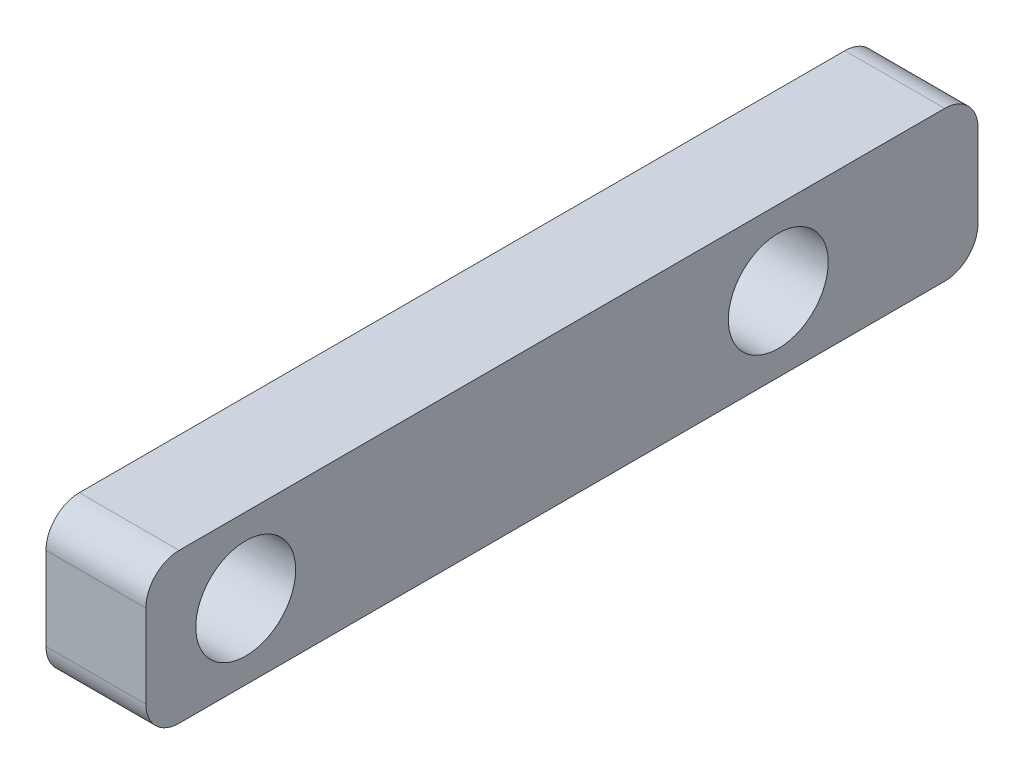
ISO-10303-21;
HEADER;
FILE_DESCRIPTION(('STEP AP214'),'2;1');
FILE_NAME('part.step','',(''),(''),'','','');
FILE_SCHEMA(('AUTOMOTIVE_DESIGN { 1 0 10303 214 1 1 1 1 }'));
ENDSEC;
DATA;
#1=APPLICATION_CONTEXT('core data for automotive mechanical design processes');
#2=APPLICATION_PROTOCOL_DEFINITION('international standard','automotive_design',2000,#1);
#3=PRODUCT_CONTEXT('',#1,'mechanical');
#4=PRODUCT('Part','Part','',(#3));
#5=PRODUCT_RELATED_PRODUCT_CATEGORY('part','',(#4));
#6=PRODUCT_DEFINITION_FORMATION('','',#4);
#7=PRODUCT_DEFINITION_CONTEXT('part definition',#1,'design');
#8=PRODUCT_DEFINITION('design','',#6,#7);
#9=PRODUCT_DEFINITION_SHAPE('','',#8);
#10=(LENGTH_UNIT() NAMED_UNIT(*) SI_UNIT(.MILLI.,.METRE.));
#11=(NAMED_UNIT(*) PLANE_ANGLE_UNIT() SI_UNIT($,.RADIAN.));
#12=(NAMED_UNIT(*) SI_UNIT($,.STERADIAN.) SOLID_ANGLE_UNIT());
#13=UNCERTAINTY_MEASURE_WITH_UNIT(LENGTH_MEASURE(1.E-05),#10,'distance_accuracy_value','');
#14=(GEOMETRIC_REPRESENTATION_CONTEXT(3) GLOBAL_UNCERTAINTY_ASSIGNED_CONTEXT((#13)) GLOBAL_UNIT_ASSIGNED_CONTEXT((#10,
#11,#12)) REPRESENTATION_CONTEXT('',''));
#15=CARTESIAN_POINT('',(0.,0.,0.));
#16=DIRECTION('',(0.,0.,1.));
#17=DIRECTION('',(1.,0.,0.));
#18=AXIS2_PLACEMENT_3D('',#15,#16,#17);
#19=CARTESIAN_POINT('',(1.5,-1.25,11.5));
#20=DIRECTION('',(-1.,0.,0.));
#21=DIRECTION('',(0.,0.,1.));
#22=AXIS2_PLACEMENT_3D('',#19,#20,#21);
#23=CYLINDRICAL_SURFACE('',#22,1.);
#24=CARTESIAN_POINT('',(-1.5,-1.25,11.5));
#25=DIRECTION('',(1.,0.,0.));
#26=DIRECTION('',(0.,0.,-1.));
#27=AXIS2_PLACEMENT_3D('',#24,#25,#26);
#28=CIRCLE('',#27,1.);
#29=CARTESIAN_POINT('',(-1.5,-1.25,12.5));
#30=VERTEX_POINT('',#29);
#31=CARTESIAN_POINT('',(-1.5,-2.25,11.5));
#32=VERTEX_POINT('',#31);
#33=EDGE_CURVE('E128',#30,#32,#28,.T.);
#34=ORIENTED_EDGE('',*,*,#33,.T.);
#35=DIRECTION('',(-1.,0.,0.));
#36=VECTOR('',#35,1.);
#37=CARTESIAN_POINT('',(1.5,-2.25,11.5));
#38=LINE('',#37,#36);
#39=CARTESIAN_POINT('',(1.5,-2.25,11.5));
#40=VERTEX_POINT('',#39);
#41=EDGE_CURVE('E11',#40,#32,#38,.T.);
#42=ORIENTED_EDGE('',*,*,#41,.F.);
#43=CARTESIAN_POINT('',(1.5,-1.25,11.5));
#44=DIRECTION('',(1.,0.,0.));
#45=DIRECTION('',(0.,0.,-1.));
#46=AXIS2_PLACEMENT_3D('',#43,#44,#45);
#47=CIRCLE('',#46,1.);
#48=CARTESIAN_POINT('',(1.5,-1.25,12.5));
#49=VERTEX_POINT('',#48);
#50=EDGE_CURVE('E143',#49,#40,#47,.T.);
#51=ORIENTED_EDGE('',*,*,#50,.F.);
#52=DIRECTION('',(-1.,0.,0.));
#53=VECTOR('',#52,1.);
#54=CARTESIAN_POINT('',(1.5,-1.25,12.5));
#55=LINE('',#54,#53);
#56=EDGE_CURVE('E124',#49,#30,#55,.T.);
#57=ORIENTED_EDGE('',*,*,#56,.T.);
#58=EDGE_LOOP('',(#34,#42,#51,#57));
#59=FACE_BOUND('',#58,.T.);
#60=ADVANCED_FACE('F32',(#59),#23,.T.);
#61=CARTESIAN_POINT('',(1.5,-2.25,11.5));
#62=DIRECTION('',(0.,1.,0.));
#63=DIRECTION('',(0.,0.,1.));
#64=AXIS2_PLACEMENT_3D('',#61,#62,#63);
#65=PLANE('',#64);
#66=DIRECTION('',(0.,0.,-1.));
#67=VECTOR('',#66,1.);
#68=CARTESIAN_POINT('',(-1.5,-2.25,11.5));
#69=LINE('',#68,#67);
#70=CARTESIAN_POINT('',(-1.5,-2.25,-11.5));
#71=VERTEX_POINT('',#70);
#72=EDGE_CURVE('E131',#32,#71,#69,.T.);
#73=ORIENTED_EDGE('',*,*,#72,.T.);
#74=DIRECTION('',(-1.,0.,0.));
#75=VECTOR('',#74,1.);
#76=CARTESIAN_POINT('',(1.5,-2.25,-11.5));
#77=LINE('',#76,#75);
#78=CARTESIAN_POINT('',(1.5,-2.25,-11.5));
#79=VERTEX_POINT('',#78);
#80=EDGE_CURVE('E40',#79,#71,#77,.T.);
#81=ORIENTED_EDGE('',*,*,#80,.F.);
#82=DIRECTION('',(0.,0.,-1.));
#83=VECTOR('',#82,1.);
#84=CARTESIAN_POINT('',(1.5,-2.25,11.5));
#85=LINE('',#84,#83);
#86=EDGE_CURVE('E91',#40,#79,#85,.T.);
#87=ORIENTED_EDGE('',*,*,#86,.F.);
#88=ORIENTED_EDGE('',*,*,#41,.T.);
#89=EDGE_LOOP('',(#73,#81,#87,#88));
#90=FACE_BOUND('',#89,.T.);
#91=ADVANCED_FACE('F210',(#90),#65,.F.);
#92=CARTESIAN_POINT('',(1.5,-1.25,-11.5));
#93=DIRECTION('',(-1.,0.,0.));
#94=DIRECTION('',(0.,0.,1.));
#95=AXIS2_PLACEMENT_3D('',#92,#93,#94);
#96=CYLINDRICAL_SURFACE('',#95,1.);
#97=CARTESIAN_POINT('',(-1.5,-1.25,-11.5));
#98=DIRECTION('',(1.,0.,0.));
#99=DIRECTION('',(0.,0.,-1.));
#100=AXIS2_PLACEMENT_3D('',#97,#98,#99);
#101=CIRCLE('',#100,1.);
#102=CARTESIAN_POINT('',(-1.5,-1.25,-12.5));
#103=VERTEX_POINT('',#102);
#104=EDGE_CURVE('E134',#71,#103,#101,.T.);
#105=ORIENTED_EDGE('',*,*,#104,.T.);
#106=DIRECTION('',(-1.,0.,0.));
#107=VECTOR('',#106,1.);
#108=CARTESIAN_POINT('',(1.5,-1.25,-12.5));
#109=LINE('',#108,#107);
#110=CARTESIAN_POINT('',(1.5,-1.25,-12.5));
#111=VERTEX_POINT('',#110);
#112=EDGE_CURVE('E150',#111,#103,#109,.T.);
#113=ORIENTED_EDGE('',*,*,#112,.F.);
#114=CARTESIAN_POINT('',(1.5,-1.25,-11.5));
#115=DIRECTION('',(1.,0.,0.));
#116=DIRECTION('',(0.,0.,-1.));
#117=AXIS2_PLACEMENT_3D('',#114,#115,#116);
#118=CIRCLE('',#117,1.);
#119=EDGE_CURVE('E158',#79,#111,#118,.T.);
#120=ORIENTED_EDGE('',*,*,#119,.F.);
#121=ORIENTED_EDGE('',*,*,#80,.T.);
#122=EDGE_LOOP('',(#105,#113,#120,#121));
#123=FACE_BOUND('',#122,.T.);
#124=ADVANCED_FACE('F156',(#123),#96,.T.);
#125=CARTESIAN_POINT('',(1.5,1.25,-12.5));
#126=DIRECTION('',(0.,0.,1.));
#127=DIRECTION('',(1.,0.,0.));
#128=AXIS2_PLACEMENT_3D('',#125,#126,#127);
#129=PLANE('',#128);
#130=DIRECTION('',(0.,1.,0.));
#131=VECTOR('',#130,1.);
#132=CARTESIAN_POINT('',(-1.5,1.25,-12.5));
#133=LINE('',#132,#131);
#134=CARTESIAN_POINT('',(-1.5,1.25,-12.5));
#135=VERTEX_POINT('',#134);
#136=EDGE_CURVE('E136',#103,#135,#133,.T.);
#137=ORIENTED_EDGE('',*,*,#136,.T.);
#138=DIRECTION('',(-1.,0.,0.));
#139=VECTOR('',#138,1.);
#140=CARTESIAN_POINT('',(1.5,1.25,-12.5));
#141=LINE('',#140,#139);
#142=CARTESIAN_POINT('',(1.5,1.25,-12.5));
#143=VERTEX_POINT('',#142);
#144=EDGE_CURVE('E147',#143,#135,#141,.T.);
#145=ORIENTED_EDGE('',*,*,#144,.F.);
#146=DIRECTION('',(0.,1.,0.));
#147=VECTOR('',#146,1.);
#148=CARTESIAN_POINT('',(1.5,1.25,-12.5));
#149=LINE('',#148,#147);
#150=EDGE_CURVE('E170',#111,#143,#149,.T.);
#151=ORIENTED_EDGE('',*,*,#150,.F.);
#152=ORIENTED_EDGE('',*,*,#112,.T.);
#153=EDGE_LOOP('',(#137,#145,#151,#152));
#154=FACE_BOUND('',#153,.T.);
#155=ADVANCED_FACE('F166',(#154),#129,.F.);
#156=CARTESIAN_POINT('',(1.5,1.25,-11.5));
#157=DIRECTION('',(-1.,0.,0.));
#158=DIRECTION('',(0.,0.,1.));
#159=AXIS2_PLACEMENT_3D('',#156,#157,#158);
#160=CYLINDRICAL_SURFACE('',#159,1.);
#161=CARTESIAN_POINT('',(-1.5,1.25,-11.5));
#162=DIRECTION('',(1.,0.,0.));
#163=DIRECTION('',(0.,0.,1.));
#164=AXIS2_PLACEMENT_3D('',#161,#162,#163);
#165=CIRCLE('',#164,1.);
#166=CARTESIAN_POINT('',(-1.5,2.25,-11.5));
#167=VERTEX_POINT('',#166);
#168=EDGE_CURVE('E138',#135,#167,#165,.T.);
#169=ORIENTED_EDGE('',*,*,#168,.T.);
#170=DIRECTION('',(-1.,0.,0.));
#171=VECTOR('',#170,1.);
#172=CARTESIAN_POINT('',(1.5,2.25,-11.5));
#173=LINE('',#172,#171);
#174=CARTESIAN_POINT('',(1.5,2.25,-11.5));
#175=VERTEX_POINT('',#174);
#176=EDGE_CURVE('E119',#175,#167,#173,.T.);
#177=ORIENTED_EDGE('',*,*,#176,.F.);
#178=CARTESIAN_POINT('',(1.5,1.25,-11.5));
#179=DIRECTION('',(1.,0.,0.));
#180=DIRECTION('',(0.,0.,1.));
#181=AXIS2_PLACEMENT_3D('',#178,#179,#180);
#182=CIRCLE('',#181,1.);
#183=EDGE_CURVE('E110',#143,#175,#182,.T.);
#184=ORIENTED_EDGE('',*,*,#183,.F.);
#185=ORIENTED_EDGE('',*,*,#144,.T.);
#186=EDGE_LOOP('',(#169,#177,#184,#185));
#187=FACE_BOUND('',#186,.T.);
#188=ADVANCED_FACE('F169',(#187),#160,.T.);
#189=CARTESIAN_POINT('',(1.5,2.25,11.5));
#190=DIRECTION('',(0.,-1.,0.));
#191=DIRECTION('',(0.,0.,-1.));
#192=AXIS2_PLACEMENT_3D('',#189,#190,#191);
#193=PLANE('',#192);
#194=DIRECTION('',(0.,0.,1.));
#195=VECTOR('',#194,1.);
#196=CARTESIAN_POINT('',(-1.5,2.25,11.5));
#197=LINE('',#196,#195);
#198=CARTESIAN_POINT('',(-1.5,2.25,11.5));
#199=VERTEX_POINT('',#198);
#200=EDGE_CURVE('E118',#167,#199,#197,.T.);
#201=ORIENTED_EDGE('',*,*,#200,.T.);
#202=DIRECTION('',(-1.,0.,0.));
#203=VECTOR('',#202,1.);
#204=CARTESIAN_POINT('',(1.5,2.25,11.5));
#205=LINE('',#204,#203);
#206=CARTESIAN_POINT('',(1.5,2.25,11.5));
#207=VERTEX_POINT('',#206);
#208=EDGE_CURVE('E115',#207,#199,#205,.T.);
#209=ORIENTED_EDGE('',*,*,#208,.F.);
#210=DIRECTION('',(0.,0.,1.));
#211=VECTOR('',#210,1.);
#212=CARTESIAN_POINT('',(1.5,2.25,11.5));
#213=LINE('',#212,#211);
#214=EDGE_CURVE('E104',#175,#207,#213,.T.);
#215=ORIENTED_EDGE('',*,*,#214,.F.);
#216=ORIENTED_EDGE('',*,*,#176,.T.);
#217=EDGE_LOOP('',(#201,#209,#215,#216));
#218=FACE_BOUND('',#217,.T.);
#219=ADVANCED_FACE('F116',(#218),#193,.F.);
#220=CARTESIAN_POINT('',(1.5,1.25,11.5));
#221=DIRECTION('',(-1.,0.,0.));
#222=DIRECTION('',(0.,0.,1.));
#223=AXIS2_PLACEMENT_3D('',#220,#221,#222);
#224=CYLINDRICAL_SURFACE('',#223,1.);
#225=CARTESIAN_POINT('',(-1.5,1.25,11.5));
#226=DIRECTION('',(1.,0.,0.));
#227=DIRECTION('',(0.,0.,1.));
#228=AXIS2_PLACEMENT_3D('',#225,#226,#227);
#229=CIRCLE('',#228,1.);
#230=CARTESIAN_POINT('',(-1.5,1.25,12.5));
#231=VERTEX_POINT('',#230);
#232=EDGE_CURVE('E77',#199,#231,#229,.T.);
#233=ORIENTED_EDGE('',*,*,#232,.T.);
#234=DIRECTION('',(-1.,0.,0.));
#235=VECTOR('',#234,1.);
#236=CARTESIAN_POINT('',(1.5,1.25,12.5));
#237=LINE('',#236,#235);
#238=CARTESIAN_POINT('',(1.5,1.25,12.5));
#239=VERTEX_POINT('',#238);
#240=EDGE_CURVE('E120',#239,#231,#237,.T.);
#241=ORIENTED_EDGE('',*,*,#240,.F.);
#242=CARTESIAN_POINT('',(1.5,1.25,11.5));
#243=DIRECTION('',(1.,0.,0.));
#244=DIRECTION('',(0.,0.,1.));
#245=AXIS2_PLACEMENT_3D('',#242,#243,#244);
#246=CIRCLE('',#245,1.);
#247=EDGE_CURVE('E108',#207,#239,#246,.T.);
#248=ORIENTED_EDGE('',*,*,#247,.F.);
#249=ORIENTED_EDGE('',*,*,#208,.T.);
#250=EDGE_LOOP('',(#233,#241,#248,#249));
#251=FACE_BOUND('',#250,.T.);
#252=ADVANCED_FACE('F122',(#251),#224,.T.);
#253=CARTESIAN_POINT('',(1.5,1.25,12.5));
#254=DIRECTION('',(0.,0.,-1.));
#255=DIRECTION('',(-1.,0.,0.));
#256=AXIS2_PLACEMENT_3D('',#253,#254,#255);
#257=PLANE('',#256);
#258=DIRECTION('',(0.,-1.,0.));
#259=VECTOR('',#258,1.);
#260=CARTESIAN_POINT('',(-1.5,1.25,12.5));
#261=LINE('',#260,#259);
#262=EDGE_CURVE('E83',#231,#30,#261,.T.);
#263=ORIENTED_EDGE('',*,*,#262,.T.);
#264=ORIENTED_EDGE('',*,*,#56,.F.);
#265=DIRECTION('',(0.,-1.,0.));
#266=VECTOR('',#265,1.);
#267=CARTESIAN_POINT('',(1.5,1.25,12.5));
#268=LINE('',#267,#266);
#269=EDGE_CURVE('E48',#239,#49,#268,.T.);
#270=ORIENTED_EDGE('',*,*,#269,.F.);
#271=ORIENTED_EDGE('',*,*,#240,.T.);
#272=EDGE_LOOP('',(#263,#264,#270,#271));
#273=FACE_BOUND('',#272,.T.);
#274=ADVANCED_FACE('F192',(#273),#257,.F.);
#275=CARTESIAN_POINT('',(1.5,-1.25,11.5));
#276=DIRECTION('',(1.,0.,0.));
#277=DIRECTION('',(0.,0.,-1.));
#278=AXIS2_PLACEMENT_3D('',#275,#276,#277);
#279=PLANE('',#278);
#280=CARTESIAN_POINT('',(1.5,0.,9.5));
#281=DIRECTION('',(1.,0.,0.));
#282=DIRECTION('',(0.,0.,-1.));
#283=AXIS2_PLACEMENT_3D('',#280,#281,#282);
#284=CIRCLE('',#283,1.5);
#285=CARTESIAN_POINT('',(1.5,0.,8.));
#286=VERTEX_POINT('',#285);
#287=EDGE_CURVE('E179',#286,#286,#284,.T.);
#288=ORIENTED_EDGE('',*,*,#287,.F.);
#289=EDGE_LOOP('',(#288));
#290=FACE_BOUND('',#289,.T.);
#291=CARTESIAN_POINT('',(1.5,0.,-6.5));
#292=DIRECTION('',(1.,0.,0.));
#293=DIRECTION('',(0.,0.,-1.));
#294=AXIS2_PLACEMENT_3D('',#291,#292,#293);
#295=CIRCLE('',#294,1.5);
#296=CARTESIAN_POINT('',(1.5,0.,-8.00000000000001));
#297=VERTEX_POINT('',#296);
#298=EDGE_CURVE('E180',#297,#297,#295,.T.);
#299=ORIENTED_EDGE('',*,*,#298,.F.);
#300=EDGE_LOOP('',(#299));
#301=FACE_BOUND('',#300,.T.);
#302=ORIENTED_EDGE('',*,*,#50,.T.);
#303=ORIENTED_EDGE('',*,*,#86,.T.);
#304=ORIENTED_EDGE('',*,*,#119,.T.);
#305=ORIENTED_EDGE('',*,*,#150,.T.);
#306=ORIENTED_EDGE('',*,*,#183,.T.);
#307=ORIENTED_EDGE('',*,*,#214,.T.);
#308=ORIENTED_EDGE('',*,*,#247,.T.);
#309=ORIENTED_EDGE('',*,*,#269,.T.);
#310=EDGE_LOOP('',(#302,#303,#304,#305,#306,#307,#308,#309));
#311=FACE_BOUND('',#310,.T.);
#312=ADVANCED_FACE('F106',(#290,#301,#311),#279,.T.);
#313=CARTESIAN_POINT('',(-1.5,-1.25,11.5));
#314=DIRECTION('',(1.,0.,0.));
#315=DIRECTION('',(0.,0.,-1.));
#316=AXIS2_PLACEMENT_3D('',#313,#314,#315);
#317=PLANE('',#316);
#318=CARTESIAN_POINT('',(-1.5,0.,9.5));
#319=DIRECTION('',(1.,0.,0.));
#320=DIRECTION('',(0.,0.,-1.));
#321=AXIS2_PLACEMENT_3D('',#318,#319,#320);
#322=CIRCLE('',#321,1.5);
#323=CARTESIAN_POINT('',(-1.5,0.,8.));
#324=VERTEX_POINT('',#323);
#325=EDGE_CURVE('E132',#324,#324,#322,.T.);
#326=ORIENTED_EDGE('',*,*,#325,.T.);
#327=EDGE_LOOP('',(#326));
#328=FACE_BOUND('',#327,.T.);
#329=CARTESIAN_POINT('',(-1.5,0.,-6.5));
#330=DIRECTION('',(1.,0.,0.));
#331=DIRECTION('',(0.,0.,-1.));
#332=AXIS2_PLACEMENT_3D('',#329,#330,#331);
#333=CIRCLE('',#332,1.5);
#334=CARTESIAN_POINT('',(-1.5,0.,-8.00000000000001));
#335=VERTEX_POINT('',#334);
#336=EDGE_CURVE('E176',#335,#335,#333,.T.);
#337=ORIENTED_EDGE('',*,*,#336,.T.);
#338=EDGE_LOOP('',(#337));
#339=FACE_BOUND('',#338,.T.);
#340=ORIENTED_EDGE('',*,*,#33,.F.);
#341=ORIENTED_EDGE('',*,*,#262,.F.);
#342=ORIENTED_EDGE('',*,*,#232,.F.);
#343=ORIENTED_EDGE('',*,*,#200,.F.);
#344=ORIENTED_EDGE('',*,*,#168,.F.);
#345=ORIENTED_EDGE('',*,*,#136,.F.);
#346=ORIENTED_EDGE('',*,*,#104,.F.);
#347=ORIENTED_EDGE('',*,*,#72,.F.);
#348=EDGE_LOOP('',(#340,#341,#342,#343,#344,#345,#346,#347));
#349=FACE_BOUND('',#348,.T.);
#350=ADVANCED_FACE('F162',(#328,#339,#349),#317,.F.);
#351=CARTESIAN_POINT('',(-1.5,0.,-6.5));
#352=DIRECTION('',(1.,0.,0.));
#353=DIRECTION('',(0.,0.,-1.));
#354=AXIS2_PLACEMENT_3D('',#351,#352,#353);
#355=CYLINDRICAL_SURFACE('',#354,1.5);
#356=ORIENTED_EDGE('',*,*,#336,.F.);
#357=EDGE_LOOP('',(#356));
#358=FACE_BOUND('',#357,.T.);
#359=ORIENTED_EDGE('',*,*,#298,.T.);
#360=EDGE_LOOP('',(#359));
#361=FACE_BOUND('',#360,.T.);
#362=ADVANCED_FACE('F196',(#358,#361),#355,.F.);
#363=CARTESIAN_POINT('',(-1.5,0.,9.5));
#364=DIRECTION('',(1.,0.,0.));
#365=DIRECTION('',(0.,0.,-1.));
#366=AXIS2_PLACEMENT_3D('',#363,#364,#365);
#367=CYLINDRICAL_SURFACE('',#366,1.5);
#368=ORIENTED_EDGE('',*,*,#325,.F.);
#369=EDGE_LOOP('',(#368));
#370=FACE_BOUND('',#369,.T.);
#371=ORIENTED_EDGE('',*,*,#287,.T.);
#372=EDGE_LOOP('',(#371));
#373=FACE_BOUND('',#372,.T.);
#374=ADVANCED_FACE('F188',(#370,#373),#367,.F.);
#375=CLOSED_SHELL('',(#60,#91,#124,#155,#188,#219,#252,#274,#312,#350,#362,#374));
#376=MANIFOLD_SOLID_BREP('B2',#375);
#377=ADVANCED_BREP_SHAPE_REPRESENTATION('',(#18,#376),#14);
#378=SHAPE_DEFINITION_REPRESENTATION(#9,#377);
ENDSEC;
END-ISO-10303-21;
